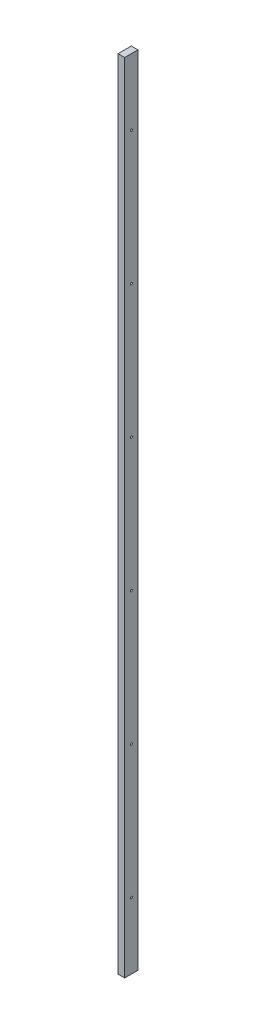
ISO-10303-21;
HEADER;
FILE_DESCRIPTION(('STEP AP214'),'2;1');
FILE_NAME('part.step','',(''),(''),'','','');
FILE_SCHEMA(('AUTOMOTIVE_DESIGN { 1 0 10303 214 1 1 1 1 }'));
ENDSEC;
DATA;
#1=APPLICATION_CONTEXT('core data for automotive mechanical design processes');
#2=APPLICATION_PROTOCOL_DEFINITION('international standard','automotive_design',2000,#1);
#3=PRODUCT_CONTEXT('',#1,'mechanical');
#4=PRODUCT('Part','Part','',(#3));
#5=PRODUCT_RELATED_PRODUCT_CATEGORY('part','',(#4));
#6=PRODUCT_DEFINITION_FORMATION('','',#4);
#7=PRODUCT_DEFINITION_CONTEXT('part definition',#1,'design');
#8=PRODUCT_DEFINITION('design','',#6,#7);
#9=PRODUCT_DEFINITION_SHAPE('','',#8);
#10=(LENGTH_UNIT() NAMED_UNIT(*) SI_UNIT(.MILLI.,.METRE.));
#11=(NAMED_UNIT(*) PLANE_ANGLE_UNIT() SI_UNIT($,.RADIAN.));
#12=(NAMED_UNIT(*) SI_UNIT($,.STERADIAN.) SOLID_ANGLE_UNIT());
#13=UNCERTAINTY_MEASURE_WITH_UNIT(LENGTH_MEASURE(1.E-05),#10,'distance_accuracy_value','');
#14=(GEOMETRIC_REPRESENTATION_CONTEXT(3) GLOBAL_UNCERTAINTY_ASSIGNED_CONTEXT((#13)) GLOBAL_UNIT_ASSIGNED_CONTEXT((#10,
#11,#12)) REPRESENTATION_CONTEXT('',''));
#15=CARTESIAN_POINT('',(0.,0.,0.));
#16=DIRECTION('',(0.,0.,1.));
#17=DIRECTION('',(1.,0.,0.));
#18=AXIS2_PLACEMENT_3D('',#15,#16,#17);
#19=CARTESIAN_POINT('',(-12.5,3000.,-25.));
#20=DIRECTION('',(1.,0.,0.));
#21=DIRECTION('',(0.,0.,-1.));
#22=AXIS2_PLACEMENT_3D('',#19,#20,#21);
#23=PLANE('',#22);
#24=CARTESIAN_POINT('',(-12.5,250.,0.));
#25=DIRECTION('',(1.,0.,0.));
#26=DIRECTION('',(0.,0.,-1.));
#27=AXIS2_PLACEMENT_3D('',#24,#25,#26);
#28=CIRCLE('',#27,4.);
#29=CARTESIAN_POINT('',(-12.5,250.,-4.));
#30=VERTEX_POINT('',#29);
#31=EDGE_CURVE('E114',#30,#30,#28,.T.);
#32=ORIENTED_EDGE('',*,*,#31,.T.);
#33=EDGE_LOOP('',(#32));
#34=FACE_BOUND('',#33,.T.);
#35=CARTESIAN_POINT('',(-12.5,2250.,0.));
#36=DIRECTION('',(1.,0.,0.));
#37=DIRECTION('',(0.,0.,-1.));
#38=AXIS2_PLACEMENT_3D('',#35,#36,#37);
#39=CIRCLE('',#38,4.);
#40=CARTESIAN_POINT('',(-12.5,2250.,-4.0000000000001));
#41=VERTEX_POINT('',#40);
#42=EDGE_CURVE('E134',#41,#41,#39,.T.);
#43=ORIENTED_EDGE('',*,*,#42,.T.);
#44=EDGE_LOOP('',(#43));
#45=FACE_BOUND('',#44,.T.);
#46=CARTESIAN_POINT('',(-12.5,2750.,0.));
#47=DIRECTION('',(1.,0.,0.));
#48=DIRECTION('',(0.,0.,-1.));
#49=AXIS2_PLACEMENT_3D('',#46,#47,#48);
#50=CIRCLE('',#49,4.);
#51=CARTESIAN_POINT('',(-12.5,2750.,-4.00000000000004));
#52=VERTEX_POINT('',#51);
#53=EDGE_CURVE('E138',#52,#52,#50,.T.);
#54=ORIENTED_EDGE('',*,*,#53,.T.);
#55=EDGE_LOOP('',(#54));
#56=FACE_BOUND('',#55,.T.);
#57=CARTESIAN_POINT('',(-12.5,1750.,0.));
#58=DIRECTION('',(1.,0.,0.));
#59=DIRECTION('',(0.,0.,-1.));
#60=AXIS2_PLACEMENT_3D('',#57,#58,#59);
#61=CIRCLE('',#60,4.);
#62=CARTESIAN_POINT('',(-12.5,1750.,-4.));
#63=VERTEX_POINT('',#62);
#64=EDGE_CURVE('E142',#63,#63,#61,.T.);
#65=ORIENTED_EDGE('',*,*,#64,.T.);
#66=EDGE_LOOP('',(#65));
#67=FACE_BOUND('',#66,.T.);
#68=CARTESIAN_POINT('',(-12.5,1250.,0.));
#69=DIRECTION('',(1.,0.,0.));
#70=DIRECTION('',(0.,0.,-1.));
#71=AXIS2_PLACEMENT_3D('',#68,#69,#70);
#72=CIRCLE('',#71,4.);
#73=CARTESIAN_POINT('',(-12.5,1250.,-4.));
#74=VERTEX_POINT('',#73);
#75=EDGE_CURVE('E146',#74,#74,#72,.T.);
#76=ORIENTED_EDGE('',*,*,#75,.T.);
#77=EDGE_LOOP('',(#76));
#78=FACE_BOUND('',#77,.T.);
#79=CARTESIAN_POINT('',(-12.5,750.,0.));
#80=DIRECTION('',(1.,0.,0.));
#81=DIRECTION('',(0.,0.,-1.));
#82=AXIS2_PLACEMENT_3D('',#79,#80,#81);
#83=CIRCLE('',#82,4.);
#84=CARTESIAN_POINT('',(-12.5,750.,-4.));
#85=VERTEX_POINT('',#84);
#86=EDGE_CURVE('E150',#85,#85,#83,.T.);
#87=ORIENTED_EDGE('',*,*,#86,.T.);
#88=EDGE_LOOP('',(#87));
#89=FACE_BOUND('',#88,.T.);
#90=DIRECTION('',(0.,0.,1.));
#91=VECTOR('',#90,1.);
#92=CARTESIAN_POINT('',(-12.5,0.,-25.));
#93=LINE('',#92,#91);
#94=CARTESIAN_POINT('',(-12.5,0.,-25.));
#95=VERTEX_POINT('',#94);
#96=CARTESIAN_POINT('',(-12.5,0.,25.));
#97=VERTEX_POINT('',#96);
#98=EDGE_CURVE('E110',#95,#97,#93,.T.);
#99=ORIENTED_EDGE('',*,*,#98,.T.);
#100=DIRECTION('',(0.,-1.,0.));
#101=VECTOR('',#100,1.);
#102=CARTESIAN_POINT('',(-12.5,3000.,25.));
#103=LINE('',#102,#101);
#104=CARTESIAN_POINT('',(-12.5,3000.,25.));
#105=VERTEX_POINT('',#104);
#106=EDGE_CURVE('E11',#105,#97,#103,.T.);
#107=ORIENTED_EDGE('',*,*,#106,.F.);
#108=DIRECTION('',(0.,0.,1.));
#109=VECTOR('',#108,1.);
#110=CARTESIAN_POINT('',(-12.5,3000.,-25.));
#111=LINE('',#110,#109);
#112=CARTESIAN_POINT('',(-12.5,3000.,-25.));
#113=VERTEX_POINT('',#112);
#114=EDGE_CURVE('E94',#113,#105,#111,.T.);
#115=ORIENTED_EDGE('',*,*,#114,.F.);
#116=DIRECTION('',(0.,-1.,0.));
#117=VECTOR('',#116,1.);
#118=CARTESIAN_POINT('',(-12.5,3000.,-25.));
#119=LINE('',#118,#117);
#120=EDGE_CURVE('E106',#113,#95,#119,.T.);
#121=ORIENTED_EDGE('',*,*,#120,.T.);
#122=EDGE_LOOP('',(#99,#107,#115,#121));
#123=FACE_BOUND('',#122,.T.);
#124=ADVANCED_FACE('F42',(#34,#45,#56,#67,#78,#89,#123),#23,.F.);
#125=CARTESIAN_POINT('',(12.5,3000.,25.));
#126=DIRECTION('',(0.,0.,-1.));
#127=DIRECTION('',(-1.,0.,0.));
#128=AXIS2_PLACEMENT_3D('',#125,#126,#127);
#129=PLANE('',#128);
#130=DIRECTION('',(1.,0.,0.));
#131=VECTOR('',#130,1.);
#132=CARTESIAN_POINT('',(12.5,0.,25.));
#133=LINE('',#132,#131);
#134=CARTESIAN_POINT('',(12.5,0.,25.));
#135=VERTEX_POINT('',#134);
#136=EDGE_CURVE('E99',#97,#135,#133,.T.);
#137=ORIENTED_EDGE('',*,*,#136,.T.);
#138=DIRECTION('',(0.,-1.,0.));
#139=VECTOR('',#138,1.);
#140=CARTESIAN_POINT('',(12.5,3000.,25.));
#141=LINE('',#140,#139);
#142=CARTESIAN_POINT('',(12.5,3000.,25.));
#143=VERTEX_POINT('',#142);
#144=EDGE_CURVE('E51',#143,#135,#141,.T.);
#145=ORIENTED_EDGE('',*,*,#144,.F.);
#146=DIRECTION('',(1.,0.,0.));
#147=VECTOR('',#146,1.);
#148=CARTESIAN_POINT('',(12.5,3000.,25.));
#149=LINE('',#148,#147);
#150=EDGE_CURVE('E89',#105,#143,#149,.T.);
#151=ORIENTED_EDGE('',*,*,#150,.F.);
#152=ORIENTED_EDGE('',*,*,#106,.T.);
#153=EDGE_LOOP('',(#137,#145,#151,#152));
#154=FACE_BOUND('',#153,.T.);
#155=ADVANCED_FACE('F98',(#154),#129,.F.);
#156=CARTESIAN_POINT('',(12.5,3000.,-25.));
#157=DIRECTION('',(-1.,0.,0.));
#158=DIRECTION('',(0.,0.,1.));
#159=AXIS2_PLACEMENT_3D('',#156,#157,#158);
#160=PLANE('',#159);
#161=CARTESIAN_POINT('',(12.5,250.,0.));
#162=DIRECTION('',(1.,0.,0.));
#163=DIRECTION('',(0.,0.,-1.));
#164=AXIS2_PLACEMENT_3D('',#161,#162,#163);
#165=CIRCLE('',#164,4.);
#166=CARTESIAN_POINT('',(12.5,250.,-4.));
#167=VERTEX_POINT('',#166);
#168=EDGE_CURVE('E154',#167,#167,#165,.T.);
#169=ORIENTED_EDGE('',*,*,#168,.F.);
#170=EDGE_LOOP('',(#169));
#171=FACE_BOUND('',#170,.T.);
#172=CARTESIAN_POINT('',(12.5,2250.,0.));
#173=DIRECTION('',(1.,0.,0.));
#174=DIRECTION('',(0.,0.,-1.));
#175=AXIS2_PLACEMENT_3D('',#172,#173,#174);
#176=CIRCLE('',#175,4.);
#177=CARTESIAN_POINT('',(12.5,2250.,-4.0000000000001));
#178=VERTEX_POINT('',#177);
#179=EDGE_CURVE('E160',#178,#178,#176,.T.);
#180=ORIENTED_EDGE('',*,*,#179,.F.);
#181=EDGE_LOOP('',(#180));
#182=FACE_BOUND('',#181,.T.);
#183=CARTESIAN_POINT('',(12.5,2750.,0.));
#184=DIRECTION('',(1.,0.,0.));
#185=DIRECTION('',(0.,0.,-1.));
#186=AXIS2_PLACEMENT_3D('',#183,#184,#185);
#187=CIRCLE('',#186,4.);
#188=CARTESIAN_POINT('',(12.5,2750.,-4.00000000000004));
#189=VERTEX_POINT('',#188);
#190=EDGE_CURVE('E155',#189,#189,#187,.T.);
#191=ORIENTED_EDGE('',*,*,#190,.F.);
#192=EDGE_LOOP('',(#191));
#193=FACE_BOUND('',#192,.T.);
#194=CARTESIAN_POINT('',(12.5,1750.,0.));
#195=DIRECTION('',(1.,0.,0.));
#196=DIRECTION('',(0.,0.,-1.));
#197=AXIS2_PLACEMENT_3D('',#194,#195,#196);
#198=CIRCLE('',#197,4.);
#199=CARTESIAN_POINT('',(12.5,1750.,-4.));
#200=VERTEX_POINT('',#199);
#201=EDGE_CURVE('E159',#200,#200,#198,.T.);
#202=ORIENTED_EDGE('',*,*,#201,.F.);
#203=EDGE_LOOP('',(#202));
#204=FACE_BOUND('',#203,.T.);
#205=CARTESIAN_POINT('',(12.5,1250.,0.));
#206=DIRECTION('',(1.,0.,0.));
#207=DIRECTION('',(0.,0.,-1.));
#208=AXIS2_PLACEMENT_3D('',#205,#206,#207);
#209=CIRCLE('',#208,4.);
#210=CARTESIAN_POINT('',(12.5,1250.,-4.));
#211=VERTEX_POINT('',#210);
#212=EDGE_CURVE('E164',#211,#211,#209,.T.);
#213=ORIENTED_EDGE('',*,*,#212,.F.);
#214=EDGE_LOOP('',(#213));
#215=FACE_BOUND('',#214,.T.);
#216=CARTESIAN_POINT('',(12.5,750.,0.));
#217=DIRECTION('',(1.,0.,0.));
#218=DIRECTION('',(0.,0.,-1.));
#219=AXIS2_PLACEMENT_3D('',#216,#217,#218);
#220=CIRCLE('',#219,4.);
#221=CARTESIAN_POINT('',(12.5,750.,-4.));
#222=VERTEX_POINT('',#221);
#223=EDGE_CURVE('E168',#222,#222,#220,.T.);
#224=ORIENTED_EDGE('',*,*,#223,.F.);
#225=EDGE_LOOP('',(#224));
#226=FACE_BOUND('',#225,.T.);
#227=DIRECTION('',(0.,0.,-1.));
#228=VECTOR('',#227,1.);
#229=CARTESIAN_POINT('',(12.5,0.,-25.));
#230=LINE('',#229,#228);
#231=CARTESIAN_POINT('',(12.5,0.,-25.));
#232=VERTEX_POINT('',#231);
#233=EDGE_CURVE('E76',#135,#232,#230,.T.);
#234=ORIENTED_EDGE('',*,*,#233,.T.);
#235=DIRECTION('',(0.,-1.,0.));
#236=VECTOR('',#235,1.);
#237=CARTESIAN_POINT('',(12.5,3000.,-25.));
#238=LINE('',#237,#236);
#239=CARTESIAN_POINT('',(12.5,3000.,-25.));
#240=VERTEX_POINT('',#239);
#241=EDGE_CURVE('E101',#240,#232,#238,.T.);
#242=ORIENTED_EDGE('',*,*,#241,.F.);
#243=DIRECTION('',(0.,0.,-1.));
#244=VECTOR('',#243,1.);
#245=CARTESIAN_POINT('',(12.5,3000.,-25.));
#246=LINE('',#245,#244);
#247=EDGE_CURVE('E92',#143,#240,#246,.T.);
#248=ORIENTED_EDGE('',*,*,#247,.F.);
#249=ORIENTED_EDGE('',*,*,#144,.T.);
#250=EDGE_LOOP('',(#234,#242,#248,#249));
#251=FACE_BOUND('',#250,.T.);
#252=ADVANCED_FACE('F102',(#171,#182,#193,#204,#215,#226,#251),#160,.F.);
#253=CARTESIAN_POINT('',(12.5,3000.,-25.));
#254=DIRECTION('',(0.,0.,1.));
#255=DIRECTION('',(1.,0.,0.));
#256=AXIS2_PLACEMENT_3D('',#253,#254,#255);
#257=PLANE('',#256);
#258=DIRECTION('',(-1.,0.,0.));
#259=VECTOR('',#258,1.);
#260=CARTESIAN_POINT('',(12.5,0.,-25.));
#261=LINE('',#260,#259);
#262=EDGE_CURVE('E82',#232,#95,#261,.T.);
#263=ORIENTED_EDGE('',*,*,#262,.T.);
#264=ORIENTED_EDGE('',*,*,#120,.F.);
#265=DIRECTION('',(-1.,0.,0.));
#266=VECTOR('',#265,1.);
#267=CARTESIAN_POINT('',(12.5,3000.,-25.));
#268=LINE('',#267,#266);
#269=EDGE_CURVE('E59',#240,#113,#268,.T.);
#270=ORIENTED_EDGE('',*,*,#269,.F.);
#271=ORIENTED_EDGE('',*,*,#241,.T.);
#272=EDGE_LOOP('',(#263,#264,#270,#271));
#273=FACE_BOUND('',#272,.T.);
#274=ADVANCED_FACE('F124',(#273),#257,.F.);
#275=CARTESIAN_POINT('',(0.,3000.,0.));
#276=DIRECTION('',(0.,-1.,0.));
#277=DIRECTION('',(0.,0.,-1.));
#278=AXIS2_PLACEMENT_3D('',#275,#276,#277);
#279=PLANE('',#278);
#280=ORIENTED_EDGE('',*,*,#114,.T.);
#281=ORIENTED_EDGE('',*,*,#150,.T.);
#282=ORIENTED_EDGE('',*,*,#247,.T.);
#283=ORIENTED_EDGE('',*,*,#269,.T.);
#284=EDGE_LOOP('',(#280,#281,#282,#283));
#285=FACE_BOUND('',#284,.T.);
#286=ADVANCED_FACE('F90',(#285),#279,.F.);
#287=CARTESIAN_POINT('',(0.,0.,0.));
#288=DIRECTION('',(0.,-1.,0.));
#289=DIRECTION('',(0.,0.,-1.));
#290=AXIS2_PLACEMENT_3D('',#287,#288,#289);
#291=PLANE('',#290);
#292=ORIENTED_EDGE('',*,*,#98,.F.);
#293=ORIENTED_EDGE('',*,*,#262,.F.);
#294=ORIENTED_EDGE('',*,*,#233,.F.);
#295=ORIENTED_EDGE('',*,*,#136,.F.);
#296=EDGE_LOOP('',(#292,#293,#294,#295));
#297=FACE_BOUND('',#296,.T.);
#298=ADVANCED_FACE('F127',(#297),#291,.T.);
#299=CARTESIAN_POINT('',(-87.5,750.,0.));
#300=DIRECTION('',(1.,0.,0.));
#301=DIRECTION('',(0.,0.,-1.));
#302=AXIS2_PLACEMENT_3D('',#299,#300,#301);
#303=CYLINDRICAL_SURFACE('',#302,4.);
#304=CARTESIAN_POINT('',(12.5,750.,-4.));
#305=CARTESIAN_POINT('',(12.2395833333333,750.,-4.));
#306=CARTESIAN_POINT('',(11.9791666666667,750.,-4.));
#307=CARTESIAN_POINT('',(11.4583333333333,750.,-4.));
#308=CARTESIAN_POINT('',(11.1979166666667,750.,-4.));
#309=CARTESIAN_POINT('',(10.6770833333333,750.,-4.));
#310=CARTESIAN_POINT('',(10.4166666666667,750.,-4.));
#311=CARTESIAN_POINT('',(9.89583333333333,750.,-4.));
#312=CARTESIAN_POINT('',(9.63541666666666,750.,-4.));
#313=CARTESIAN_POINT('',(9.11458333333333,750.,-4.));
#314=CARTESIAN_POINT('',(8.85416666666666,750.,-4.));
#315=CARTESIAN_POINT('',(8.33333333333333,750.,-4.));
#316=CARTESIAN_POINT('',(8.07291666666667,750.,-4.));
#317=CARTESIAN_POINT('',(7.55208333333333,750.,-4.));
#318=CARTESIAN_POINT('',(7.29166666666667,750.,-4.));
#319=CARTESIAN_POINT('',(6.77083333333333,750.,-4.));
#320=CARTESIAN_POINT('',(6.51041666666666,750.,-4.));
#321=CARTESIAN_POINT('',(5.98958333333333,750.,-4.));
#322=CARTESIAN_POINT('',(5.72916666666666,750.,-4.));
#323=CARTESIAN_POINT('',(5.20833333333333,750.,-4.));
#324=CARTESIAN_POINT('',(4.94791666666666,750.,-4.));
#325=CARTESIAN_POINT('',(4.42708333333333,750.,-4.));
#326=CARTESIAN_POINT('',(4.16666666666667,750.,-4.));
#327=CARTESIAN_POINT('',(3.64583333333333,750.,-4.));
#328=CARTESIAN_POINT('',(3.38541666666667,750.,-4.));
#329=CARTESIAN_POINT('',(2.86458333333333,750.,-4.));
#330=CARTESIAN_POINT('',(2.60416666666666,750.,-4.));
#331=CARTESIAN_POINT('',(2.08333333333333,750.,-4.));
#332=CARTESIAN_POINT('',(1.82291666666666,750.,-4.));
#333=CARTESIAN_POINT('',(1.30208333333333,750.,-4.));
#334=CARTESIAN_POINT('',(1.04166666666666,750.,-4.));
#335=CARTESIAN_POINT('',(0.520833333333331,750.,-4.));
#336=CARTESIAN_POINT('',(0.260416666666666,750.,-4.));
#337=CARTESIAN_POINT('',(-0.260416666666666,750.,-4.));
#338=CARTESIAN_POINT('',(-0.520833333333331,750.,-4.));
#339=CARTESIAN_POINT('',(-1.04166666666666,750.,-4.));
#340=CARTESIAN_POINT('',(-1.30208333333333,750.,-4.));
#341=CARTESIAN_POINT('',(-1.82291666666666,750.,-4.));
#342=CARTESIAN_POINT('',(-2.08333333333333,750.,-4.));
#343=CARTESIAN_POINT('',(-2.60416666666666,750.,-4.));
#344=CARTESIAN_POINT('',(-2.86458333333333,750.,-4.));
#345=CARTESIAN_POINT('',(-3.38541666666667,750.,-4.));
#346=CARTESIAN_POINT('',(-3.64583333333333,750.,-4.));
#347=CARTESIAN_POINT('',(-4.16666666666667,750.,-4.));
#348=CARTESIAN_POINT('',(-4.42708333333333,750.,-4.));
#349=CARTESIAN_POINT('',(-4.94791666666666,750.,-4.));
#350=CARTESIAN_POINT('',(-5.20833333333333,750.,-4.));
#351=CARTESIAN_POINT('',(-5.72916666666666,750.,-4.));
#352=CARTESIAN_POINT('',(-5.98958333333333,750.,-4.));
#353=CARTESIAN_POINT('',(-6.51041666666666,750.,-4.));
#354=CARTESIAN_POINT('',(-6.77083333333333,750.,-4.));
#355=CARTESIAN_POINT('',(-7.29166666666667,750.,-4.));
#356=CARTESIAN_POINT('',(-7.55208333333333,750.,-4.));
#357=CARTESIAN_POINT('',(-8.07291666666667,750.,-4.));
#358=CARTESIAN_POINT('',(-8.33333333333333,750.,-4.));
#359=CARTESIAN_POINT('',(-8.85416666666666,750.,-4.));
#360=CARTESIAN_POINT('',(-9.11458333333333,750.,-4.));
#361=CARTESIAN_POINT('',(-9.63541666666666,750.,-4.));
#362=CARTESIAN_POINT('',(-9.89583333333333,750.,-4.));
#363=CARTESIAN_POINT('',(-10.4166666666667,750.,-4.));
#364=CARTESIAN_POINT('',(-10.6770833333333,750.,-4.));
#365=CARTESIAN_POINT('',(-11.1979166666667,750.,-4.));
#366=CARTESIAN_POINT('',(-11.4583333333333,750.,-4.));
#367=CARTESIAN_POINT('',(-11.9791666666667,750.,-4.));
#368=CARTESIAN_POINT('',(-12.2395833333333,750.,-4.));
#369=CARTESIAN_POINT('',(-12.5,750.,-4.));
#370=B_SPLINE_CURVE_WITH_KNOTS('',3,(#304,#305,#306,#307,#308,#309,#310,#311,#312,#313,#314,
#315,#316,#317,#318,#319,#320,#321,#322,#323,#324,#325,#326,#327,#328,#329,#330,#331,#332,#333,
#334,#335,#336,#337,#338,#339,#340,#341,#342,#343,#344,#345,#346,#347,#348,#349,#350,#351,#352,
#353,#354,#355,#356,#357,#358,#359,#360,#361,#362,#363,#364,#365,#366,#367,#368,#369),
.UNSPECIFIED.,.F.,.F.,(4,2,2,2,2,2,2,2,2,2,2,2,2,2,2,2,2,2,2,2,2,2,2,2,2,2,2,2,2,2,2,2,4),(0.,
0.781249999999997,1.56249999999999,2.34375000000001,3.125,3.90625,4.6875,5.46874999999999,
6.25000000000001,7.03125,7.8125,8.59375,9.37499999999999,10.15625,10.9375,11.71875,12.5,
13.28125,14.0625,14.84375,15.625,16.40625,17.1875,17.96875,18.75,19.53125,20.3125,21.09375,
21.875,22.65625,23.4375,24.21875,25.),.UNSPECIFIED.);
#371=EDGE_CURVE('BSEAM195',#222,#85,#370,.T.);
#372=ORIENTED_EDGE('',*,*,#223,.T.);
#373=ORIENTED_EDGE('',*,*,#86,.F.);
#374=ORIENTED_EDGE('',*,*,#371,.T.);
#375=ORIENTED_EDGE('',*,*,#371,.F.);
#376=EDGE_LOOP('',(#372,#374,#373,#375));
#377=FACE_BOUND('',#376,.T.);
#378=ADVANCED_FACE('F195',(#377),#303,.F.);
#379=CARTESIAN_POINT('',(-87.5,1250.,0.));
#380=DIRECTION('',(1.,0.,0.));
#381=DIRECTION('',(0.,0.,-1.));
#382=AXIS2_PLACEMENT_3D('',#379,#380,#381);
#383=CYLINDRICAL_SURFACE('',#382,4.);
#384=CARTESIAN_POINT('',(12.5,1250.,-4.));
#385=CARTESIAN_POINT('',(12.2395833333333,1250.,-4.));
#386=CARTESIAN_POINT('',(11.9791666666667,1250.,-4.));
#387=CARTESIAN_POINT('',(11.4583333333333,1250.,-4.));
#388=CARTESIAN_POINT('',(11.1979166666667,1250.,-4.));
#389=CARTESIAN_POINT('',(10.6770833333333,1250.,-4.));
#390=CARTESIAN_POINT('',(10.4166666666667,1250.,-4.));
#391=CARTESIAN_POINT('',(9.89583333333333,1250.,-4.));
#392=CARTESIAN_POINT('',(9.63541666666666,1250.,-4.));
#393=CARTESIAN_POINT('',(9.11458333333333,1250.,-4.));
#394=CARTESIAN_POINT('',(8.85416666666666,1250.,-4.));
#395=CARTESIAN_POINT('',(8.33333333333333,1250.,-4.));
#396=CARTESIAN_POINT('',(8.07291666666667,1250.,-4.));
#397=CARTESIAN_POINT('',(7.55208333333333,1250.,-4.));
#398=CARTESIAN_POINT('',(7.29166666666667,1250.,-4.));
#399=CARTESIAN_POINT('',(6.77083333333333,1250.,-4.));
#400=CARTESIAN_POINT('',(6.51041666666666,1250.,-4.));
#401=CARTESIAN_POINT('',(5.98958333333333,1250.,-4.));
#402=CARTESIAN_POINT('',(5.72916666666666,1250.,-4.));
#403=CARTESIAN_POINT('',(5.20833333333333,1250.,-4.));
#404=CARTESIAN_POINT('',(4.94791666666666,1250.,-4.));
#405=CARTESIAN_POINT('',(4.42708333333333,1250.,-4.));
#406=CARTESIAN_POINT('',(4.16666666666667,1250.,-4.));
#407=CARTESIAN_POINT('',(3.64583333333333,1250.,-4.));
#408=CARTESIAN_POINT('',(3.38541666666667,1250.,-4.));
#409=CARTESIAN_POINT('',(2.86458333333333,1250.,-4.));
#410=CARTESIAN_POINT('',(2.60416666666666,1250.,-4.));
#411=CARTESIAN_POINT('',(2.08333333333333,1250.,-4.));
#412=CARTESIAN_POINT('',(1.82291666666666,1250.,-4.));
#413=CARTESIAN_POINT('',(1.30208333333333,1250.,-4.));
#414=CARTESIAN_POINT('',(1.04166666666666,1250.,-4.));
#415=CARTESIAN_POINT('',(0.520833333333331,1250.,-4.));
#416=CARTESIAN_POINT('',(0.260416666666666,1250.,-4.));
#417=CARTESIAN_POINT('',(-0.260416666666666,1250.,-4.));
#418=CARTESIAN_POINT('',(-0.520833333333331,1250.,-4.));
#419=CARTESIAN_POINT('',(-1.04166666666666,1250.,-4.));
#420=CARTESIAN_POINT('',(-1.30208333333333,1250.,-4.));
#421=CARTESIAN_POINT('',(-1.82291666666666,1250.,-4.));
#422=CARTESIAN_POINT('',(-2.08333333333333,1250.,-4.));
#423=CARTESIAN_POINT('',(-2.60416666666666,1250.,-4.));
#424=CARTESIAN_POINT('',(-2.86458333333333,1250.,-4.));
#425=CARTESIAN_POINT('',(-3.38541666666667,1250.,-4.));
#426=CARTESIAN_POINT('',(-3.64583333333333,1250.,-4.));
#427=CARTESIAN_POINT('',(-4.16666666666667,1250.,-4.));
#428=CARTESIAN_POINT('',(-4.42708333333333,1250.,-4.));
#429=CARTESIAN_POINT('',(-4.94791666666666,1250.,-4.));
#430=CARTESIAN_POINT('',(-5.20833333333333,1250.,-4.));
#431=CARTESIAN_POINT('',(-5.72916666666666,1250.,-4.));
#432=CARTESIAN_POINT('',(-5.98958333333333,1250.,-4.));
#433=CARTESIAN_POINT('',(-6.51041666666666,1250.,-4.));
#434=CARTESIAN_POINT('',(-6.77083333333333,1250.,-4.));
#435=CARTESIAN_POINT('',(-7.29166666666667,1250.,-4.));
#436=CARTESIAN_POINT('',(-7.55208333333333,1250.,-4.));
#437=CARTESIAN_POINT('',(-8.07291666666667,1250.,-4.));
#438=CARTESIAN_POINT('',(-8.33333333333333,1250.,-4.));
#439=CARTESIAN_POINT('',(-8.85416666666666,1250.,-4.));
#440=CARTESIAN_POINT('',(-9.11458333333333,1250.,-4.));
#441=CARTESIAN_POINT('',(-9.63541666666666,1250.,-4.));
#442=CARTESIAN_POINT('',(-9.89583333333333,1250.,-4.));
#443=CARTESIAN_POINT('',(-10.4166666666667,1250.,-4.));
#444=CARTESIAN_POINT('',(-10.6770833333333,1250.,-4.));
#445=CARTESIAN_POINT('',(-11.1979166666667,1250.,-4.));
#446=CARTESIAN_POINT('',(-11.4583333333333,1250.,-4.));
#447=CARTESIAN_POINT('',(-11.9791666666667,1250.,-4.));
#448=CARTESIAN_POINT('',(-12.2395833333333,1250.,-4.));
#449=CARTESIAN_POINT('',(-12.5,1250.,-4.));
#450=B_SPLINE_CURVE_WITH_KNOTS('',3,(#384,#385,#386,#387,#388,#389,#390,#391,#392,#393,#394,
#395,#396,#397,#398,#399,#400,#401,#402,#403,#404,#405,#406,#407,#408,#409,#410,#411,#412,#413,
#414,#415,#416,#417,#418,#419,#420,#421,#422,#423,#424,#425,#426,#427,#428,#429,#430,#431,#432,
#433,#434,#435,#436,#437,#438,#439,#440,#441,#442,#443,#444,#445,#446,#447,#448,#449),
.UNSPECIFIED.,.F.,.F.,(4,2,2,2,2,2,2,2,2,2,2,2,2,2,2,2,2,2,2,2,2,2,2,2,2,2,2,2,2,2,2,2,4),(0.,
0.781249999999997,1.56249999999999,2.34375000000001,3.125,3.90625,4.6875,5.46874999999999,
6.25000000000001,7.03125,7.8125,8.59375,9.37499999999999,10.15625,10.9375,11.71875,12.5,
13.28125,14.0625,14.84375,15.625,16.40625,17.1875,17.96875,18.75,19.53125,20.3125,21.09375,
21.875,22.65625,23.4375,24.21875,25.),.UNSPECIFIED.);
#451=EDGE_CURVE('BSEAM198',#211,#74,#450,.T.);
#452=ORIENTED_EDGE('',*,*,#212,.T.);
#453=ORIENTED_EDGE('',*,*,#75,.F.);
#454=ORIENTED_EDGE('',*,*,#451,.T.);
#455=ORIENTED_EDGE('',*,*,#451,.F.);
#456=EDGE_LOOP('',(#452,#454,#453,#455));
#457=FACE_BOUND('',#456,.T.);
#458=ADVANCED_FACE('F198',(#457),#383,.F.);
#459=CARTESIAN_POINT('',(-87.5,1750.,0.));
#460=DIRECTION('',(1.,0.,0.));
#461=DIRECTION('',(0.,0.,-1.));
#462=AXIS2_PLACEMENT_3D('',#459,#460,#461);
#463=CYLINDRICAL_SURFACE('',#462,4.);
#464=CARTESIAN_POINT('',(12.5,1750.,-4.));
#465=CARTESIAN_POINT('',(12.2395833333333,1750.,-4.));
#466=CARTESIAN_POINT('',(11.9791666666667,1750.,-4.));
#467=CARTESIAN_POINT('',(11.4583333333333,1750.,-4.));
#468=CARTESIAN_POINT('',(11.1979166666667,1750.,-4.));
#469=CARTESIAN_POINT('',(10.6770833333333,1750.,-4.));
#470=CARTESIAN_POINT('',(10.4166666666667,1750.,-4.));
#471=CARTESIAN_POINT('',(9.89583333333333,1750.,-4.));
#472=CARTESIAN_POINT('',(9.63541666666666,1750.,-4.));
#473=CARTESIAN_POINT('',(9.11458333333333,1750.,-4.));
#474=CARTESIAN_POINT('',(8.85416666666666,1750.,-4.));
#475=CARTESIAN_POINT('',(8.33333333333333,1750.,-4.));
#476=CARTESIAN_POINT('',(8.07291666666667,1750.,-4.));
#477=CARTESIAN_POINT('',(7.55208333333333,1750.,-4.));
#478=CARTESIAN_POINT('',(7.29166666666667,1750.,-4.));
#479=CARTESIAN_POINT('',(6.77083333333333,1750.,-4.));
#480=CARTESIAN_POINT('',(6.51041666666666,1750.,-4.));
#481=CARTESIAN_POINT('',(5.98958333333333,1750.,-4.));
#482=CARTESIAN_POINT('',(5.72916666666666,1750.,-4.));
#483=CARTESIAN_POINT('',(5.20833333333333,1750.,-4.));
#484=CARTESIAN_POINT('',(4.94791666666666,1750.,-4.));
#485=CARTESIAN_POINT('',(4.42708333333333,1750.,-4.));
#486=CARTESIAN_POINT('',(4.16666666666667,1750.,-4.));
#487=CARTESIAN_POINT('',(3.64583333333333,1750.,-4.));
#488=CARTESIAN_POINT('',(3.38541666666667,1750.,-4.));
#489=CARTESIAN_POINT('',(2.86458333333333,1750.,-4.));
#490=CARTESIAN_POINT('',(2.60416666666666,1750.,-4.));
#491=CARTESIAN_POINT('',(2.08333333333333,1750.,-4.));
#492=CARTESIAN_POINT('',(1.82291666666666,1750.,-4.));
#493=CARTESIAN_POINT('',(1.30208333333333,1750.,-4.));
#494=CARTESIAN_POINT('',(1.04166666666666,1750.,-4.));
#495=CARTESIAN_POINT('',(0.520833333333331,1750.,-4.));
#496=CARTESIAN_POINT('',(0.260416666666666,1750.,-4.));
#497=CARTESIAN_POINT('',(-0.260416666666666,1750.,-4.));
#498=CARTESIAN_POINT('',(-0.520833333333331,1750.,-4.));
#499=CARTESIAN_POINT('',(-1.04166666666666,1750.,-4.));
#500=CARTESIAN_POINT('',(-1.30208333333333,1750.,-4.));
#501=CARTESIAN_POINT('',(-1.82291666666666,1750.,-4.));
#502=CARTESIAN_POINT('',(-2.08333333333333,1750.,-4.));
#503=CARTESIAN_POINT('',(-2.60416666666666,1750.,-4.));
#504=CARTESIAN_POINT('',(-2.86458333333333,1750.,-4.));
#505=CARTESIAN_POINT('',(-3.38541666666667,1750.,-4.));
#506=CARTESIAN_POINT('',(-3.64583333333333,1750.,-4.));
#507=CARTESIAN_POINT('',(-4.16666666666667,1750.,-4.));
#508=CARTESIAN_POINT('',(-4.42708333333333,1750.,-4.));
#509=CARTESIAN_POINT('',(-4.94791666666666,1750.,-4.));
#510=CARTESIAN_POINT('',(-5.20833333333333,1750.,-4.));
#511=CARTESIAN_POINT('',(-5.72916666666666,1750.,-4.));
#512=CARTESIAN_POINT('',(-5.98958333333333,1750.,-4.));
#513=CARTESIAN_POINT('',(-6.51041666666666,1750.,-4.));
#514=CARTESIAN_POINT('',(-6.77083333333333,1750.,-4.));
#515=CARTESIAN_POINT('',(-7.29166666666667,1750.,-4.));
#516=CARTESIAN_POINT('',(-7.55208333333333,1750.,-4.));
#517=CARTESIAN_POINT('',(-8.07291666666667,1750.,-4.));
#518=CARTESIAN_POINT('',(-8.33333333333333,1750.,-4.));
#519=CARTESIAN_POINT('',(-8.85416666666666,1750.,-4.));
#520=CARTESIAN_POINT('',(-9.11458333333333,1750.,-4.));
#521=CARTESIAN_POINT('',(-9.63541666666666,1750.,-4.));
#522=CARTESIAN_POINT('',(-9.89583333333333,1750.,-4.));
#523=CARTESIAN_POINT('',(-10.4166666666667,1750.,-4.));
#524=CARTESIAN_POINT('',(-10.6770833333333,1750.,-4.));
#525=CARTESIAN_POINT('',(-11.1979166666667,1750.,-4.));
#526=CARTESIAN_POINT('',(-11.4583333333333,1750.,-4.));
#527=CARTESIAN_POINT('',(-11.9791666666667,1750.,-4.));
#528=CARTESIAN_POINT('',(-12.2395833333333,1750.,-4.));
#529=CARTESIAN_POINT('',(-12.5,1750.,-4.));
#530=B_SPLINE_CURVE_WITH_KNOTS('',3,(#464,#465,#466,#467,#468,#469,#470,#471,#472,#473,#474,
#475,#476,#477,#478,#479,#480,#481,#482,#483,#484,#485,#486,#487,#488,#489,#490,#491,#492,#493,
#494,#495,#496,#497,#498,#499,#500,#501,#502,#503,#504,#505,#506,#507,#508,#509,#510,#511,#512,
#513,#514,#515,#516,#517,#518,#519,#520,#521,#522,#523,#524,#525,#526,#527,#528,#529),
.UNSPECIFIED.,.F.,.F.,(4,2,2,2,2,2,2,2,2,2,2,2,2,2,2,2,2,2,2,2,2,2,2,2,2,2,2,2,2,2,2,2,4),(0.,
0.781249999999997,1.56249999999999,2.34375000000001,3.125,3.90625,4.6875,5.46874999999999,
6.25000000000001,7.03125,7.8125,8.59375,9.37499999999999,10.15625,10.9375,11.71875,12.5,
13.28125,14.0625,14.84375,15.625,16.40625,17.1875,17.96875,18.75,19.53125,20.3125,21.09375,
21.875,22.65625,23.4375,24.21875,25.),.UNSPECIFIED.);
#531=EDGE_CURVE('BSEAM219',#200,#63,#530,.T.);
#532=ORIENTED_EDGE('',*,*,#201,.T.);
#533=ORIENTED_EDGE('',*,*,#64,.F.);
#534=ORIENTED_EDGE('',*,*,#531,.T.);
#535=ORIENTED_EDGE('',*,*,#531,.F.);
#536=EDGE_LOOP('',(#532,#534,#533,#535));
#537=FACE_BOUND('',#536,.T.);
#538=ADVANCED_FACE('F219',(#537),#463,.F.);
#539=CARTESIAN_POINT('',(-87.5,2750.,0.));
#540=DIRECTION('',(1.,0.,0.));
#541=DIRECTION('',(0.,0.,-1.));
#542=AXIS2_PLACEMENT_3D('',#539,#540,#541);
#543=CYLINDRICAL_SURFACE('',#542,4.);
#544=CARTESIAN_POINT('',(12.5,2750.,-4.00000000000004));
#545=CARTESIAN_POINT('',(12.2395833333333,2750.,-4.00000000000004));
#546=CARTESIAN_POINT('',(11.9791666666667,2750.,-4.00000000000004));
#547=CARTESIAN_POINT('',(11.4583333333333,2750.,-4.00000000000004));
#548=CARTESIAN_POINT('',(11.1979166666667,2750.,-4.00000000000004));
#549=CARTESIAN_POINT('',(10.6770833333333,2750.,-4.00000000000004));
#550=CARTESIAN_POINT('',(10.4166666666667,2750.,-4.00000000000004));
#551=CARTESIAN_POINT('',(9.89583333333333,2750.,-4.00000000000004));
#552=CARTESIAN_POINT('',(9.63541666666666,2750.,-4.00000000000004));
#553=CARTESIAN_POINT('',(9.11458333333333,2750.,-4.00000000000004));
#554=CARTESIAN_POINT('',(8.85416666666666,2750.,-4.00000000000004));
#555=CARTESIAN_POINT('',(8.33333333333333,2750.,-4.00000000000004));
#556=CARTESIAN_POINT('',(8.07291666666667,2750.,-4.00000000000004));
#557=CARTESIAN_POINT('',(7.55208333333333,2750.,-4.00000000000004));
#558=CARTESIAN_POINT('',(7.29166666666667,2750.,-4.00000000000004));
#559=CARTESIAN_POINT('',(6.77083333333333,2750.,-4.00000000000004));
#560=CARTESIAN_POINT('',(6.51041666666666,2750.,-4.00000000000004));
#561=CARTESIAN_POINT('',(5.98958333333333,2750.,-4.00000000000004));
#562=CARTESIAN_POINT('',(5.72916666666666,2750.,-4.00000000000004));
#563=CARTESIAN_POINT('',(5.20833333333333,2750.,-4.00000000000004));
#564=CARTESIAN_POINT('',(4.94791666666666,2750.,-4.00000000000004));
#565=CARTESIAN_POINT('',(4.42708333333333,2750.,-4.00000000000004));
#566=CARTESIAN_POINT('',(4.16666666666667,2750.,-4.00000000000004));
#567=CARTESIAN_POINT('',(3.64583333333333,2750.,-4.00000000000004));
#568=CARTESIAN_POINT('',(3.38541666666667,2750.,-4.00000000000004));
#569=CARTESIAN_POINT('',(2.86458333333333,2750.,-4.00000000000004));
#570=CARTESIAN_POINT('',(2.60416666666666,2750.,-4.00000000000004));
#571=CARTESIAN_POINT('',(2.08333333333333,2750.,-4.00000000000004));
#572=CARTESIAN_POINT('',(1.82291666666666,2750.,-4.00000000000004));
#573=CARTESIAN_POINT('',(1.30208333333333,2750.,-4.00000000000004));
#574=CARTESIAN_POINT('',(1.04166666666666,2750.,-4.00000000000004));
#575=CARTESIAN_POINT('',(0.520833333333331,2750.,-4.00000000000004));
#576=CARTESIAN_POINT('',(0.260416666666666,2750.,-4.00000000000004));
#577=CARTESIAN_POINT('',(-0.260416666666666,2750.,-4.00000000000004));
#578=CARTESIAN_POINT('',(-0.520833333333331,2750.,-4.00000000000004));
#579=CARTESIAN_POINT('',(-1.04166666666666,2750.,-4.00000000000004));
#580=CARTESIAN_POINT('',(-1.30208333333333,2750.,-4.00000000000004));
#581=CARTESIAN_POINT('',(-1.82291666666666,2750.,-4.00000000000004));
#582=CARTESIAN_POINT('',(-2.08333333333333,2750.,-4.00000000000004));
#583=CARTESIAN_POINT('',(-2.60416666666666,2750.,-4.00000000000004));
#584=CARTESIAN_POINT('',(-2.86458333333333,2750.,-4.00000000000004));
#585=CARTESIAN_POINT('',(-3.38541666666667,2750.,-4.00000000000004));
#586=CARTESIAN_POINT('',(-3.64583333333333,2750.,-4.00000000000004));
#587=CARTESIAN_POINT('',(-4.16666666666667,2750.,-4.00000000000004));
#588=CARTESIAN_POINT('',(-4.42708333333333,2750.,-4.00000000000004));
#589=CARTESIAN_POINT('',(-4.94791666666666,2750.,-4.00000000000004));
#590=CARTESIAN_POINT('',(-5.20833333333333,2750.,-4.00000000000004));
#591=CARTESIAN_POINT('',(-5.72916666666666,2750.,-4.00000000000004));
#592=CARTESIAN_POINT('',(-5.98958333333333,2750.,-4.00000000000004));
#593=CARTESIAN_POINT('',(-6.51041666666666,2750.,-4.00000000000004));
#594=CARTESIAN_POINT('',(-6.77083333333333,2750.,-4.00000000000004));
#595=CARTESIAN_POINT('',(-7.29166666666667,2750.,-4.00000000000004));
#596=CARTESIAN_POINT('',(-7.55208333333333,2750.,-4.00000000000004));
#597=CARTESIAN_POINT('',(-8.07291666666667,2750.,-4.00000000000004));
#598=CARTESIAN_POINT('',(-8.33333333333333,2750.,-4.00000000000004));
#599=CARTESIAN_POINT('',(-8.85416666666666,2750.,-4.00000000000004));
#600=CARTESIAN_POINT('',(-9.11458333333333,2750.,-4.00000000000004));
#601=CARTESIAN_POINT('',(-9.63541666666666,2750.,-4.00000000000004));
#602=CARTESIAN_POINT('',(-9.89583333333333,2750.,-4.00000000000004));
#603=CARTESIAN_POINT('',(-10.4166666666667,2750.,-4.00000000000004));
#604=CARTESIAN_POINT('',(-10.6770833333333,2750.,-4.00000000000004));
#605=CARTESIAN_POINT('',(-11.1979166666667,2750.,-4.00000000000004));
#606=CARTESIAN_POINT('',(-11.4583333333333,2750.,-4.00000000000004));
#607=CARTESIAN_POINT('',(-11.9791666666667,2750.,-4.00000000000004));
#608=CARTESIAN_POINT('',(-12.2395833333333,2750.,-4.00000000000004));
#609=CARTESIAN_POINT('',(-12.5,2750.,-4.00000000000004));
#610=B_SPLINE_CURVE_WITH_KNOTS('',3,(#544,#545,#546,#547,#548,#549,#550,#551,#552,#553,#554,
#555,#556,#557,#558,#559,#560,#561,#562,#563,#564,#565,#566,#567,#568,#569,#570,#571,#572,#573,
#574,#575,#576,#577,#578,#579,#580,#581,#582,#583,#584,#585,#586,#587,#588,#589,#590,#591,#592,
#593,#594,#595,#596,#597,#598,#599,#600,#601,#602,#603,#604,#605,#606,#607,#608,#609),
.UNSPECIFIED.,.F.,.F.,(4,2,2,2,2,2,2,2,2,2,2,2,2,2,2,2,2,2,2,2,2,2,2,2,2,2,2,2,2,2,2,2,4),(0.,
0.781249999999997,1.56249999999999,2.34375000000001,3.125,3.90625,4.6875,5.46874999999999,
6.25000000000001,7.03125,7.8125,8.59375,9.37499999999999,10.15625,10.9375,11.71875,12.5,
13.28125,14.0625,14.84375,15.625,16.40625,17.1875,17.96875,18.75,19.53125,20.3125,21.09375,
21.875,22.65625,23.4375,24.21875,25.),.UNSPECIFIED.);
#611=EDGE_CURVE('BSEAM225',#189,#52,#610,.T.);
#612=ORIENTED_EDGE('',*,*,#190,.T.);
#613=ORIENTED_EDGE('',*,*,#53,.F.);
#614=ORIENTED_EDGE('',*,*,#611,.T.);
#615=ORIENTED_EDGE('',*,*,#611,.F.);
#616=EDGE_LOOP('',(#612,#614,#613,#615));
#617=FACE_BOUND('',#616,.T.);
#618=ADVANCED_FACE('F225',(#617),#543,.F.);
#619=CARTESIAN_POINT('',(-87.5,2250.,0.));
#620=DIRECTION('',(1.,0.,0.));
#621=DIRECTION('',(0.,0.,-1.));
#622=AXIS2_PLACEMENT_3D('',#619,#620,#621);
#623=CYLINDRICAL_SURFACE('',#622,4.);
#624=CARTESIAN_POINT('',(12.5,2250.,-4.0000000000001));
#625=CARTESIAN_POINT('',(12.2395833333333,2250.,-4.0000000000001));
#626=CARTESIAN_POINT('',(11.9791666666667,2250.,-4.0000000000001));
#627=CARTESIAN_POINT('',(11.4583333333333,2250.,-4.0000000000001));
#628=CARTESIAN_POINT('',(11.1979166666667,2250.,-4.0000000000001));
#629=CARTESIAN_POINT('',(10.6770833333333,2250.,-4.0000000000001));
#630=CARTESIAN_POINT('',(10.4166666666667,2250.,-4.0000000000001));
#631=CARTESIAN_POINT('',(9.89583333333333,2250.,-4.0000000000001));
#632=CARTESIAN_POINT('',(9.63541666666666,2250.,-4.0000000000001));
#633=CARTESIAN_POINT('',(9.11458333333333,2250.,-4.0000000000001));
#634=CARTESIAN_POINT('',(8.85416666666666,2250.,-4.0000000000001));
#635=CARTESIAN_POINT('',(8.33333333333333,2250.,-4.0000000000001));
#636=CARTESIAN_POINT('',(8.07291666666667,2250.,-4.0000000000001));
#637=CARTESIAN_POINT('',(7.55208333333333,2250.,-4.0000000000001));
#638=CARTESIAN_POINT('',(7.29166666666667,2250.,-4.0000000000001));
#639=CARTESIAN_POINT('',(6.77083333333333,2250.,-4.0000000000001));
#640=CARTESIAN_POINT('',(6.51041666666666,2250.,-4.0000000000001));
#641=CARTESIAN_POINT('',(5.98958333333333,2250.,-4.0000000000001));
#642=CARTESIAN_POINT('',(5.72916666666666,2250.,-4.0000000000001));
#643=CARTESIAN_POINT('',(5.20833333333333,2250.,-4.0000000000001));
#644=CARTESIAN_POINT('',(4.94791666666666,2250.,-4.0000000000001));
#645=CARTESIAN_POINT('',(4.42708333333333,2250.,-4.0000000000001));
#646=CARTESIAN_POINT('',(4.16666666666667,2250.,-4.0000000000001));
#647=CARTESIAN_POINT('',(3.64583333333333,2250.,-4.0000000000001));
#648=CARTESIAN_POINT('',(3.38541666666667,2250.,-4.0000000000001));
#649=CARTESIAN_POINT('',(2.86458333333333,2250.,-4.0000000000001));
#650=CARTESIAN_POINT('',(2.60416666666666,2250.,-4.0000000000001));
#651=CARTESIAN_POINT('',(2.08333333333333,2250.,-4.0000000000001));
#652=CARTESIAN_POINT('',(1.82291666666666,2250.,-4.0000000000001));
#653=CARTESIAN_POINT('',(1.30208333333333,2250.,-4.0000000000001));
#654=CARTESIAN_POINT('',(1.04166666666666,2250.,-4.0000000000001));
#655=CARTESIAN_POINT('',(0.520833333333331,2250.,-4.0000000000001));
#656=CARTESIAN_POINT('',(0.260416666666666,2250.,-4.0000000000001));
#657=CARTESIAN_POINT('',(-0.260416666666666,2250.,-4.0000000000001));
#658=CARTESIAN_POINT('',(-0.520833333333331,2250.,-4.0000000000001));
#659=CARTESIAN_POINT('',(-1.04166666666666,2250.,-4.0000000000001));
#660=CARTESIAN_POINT('',(-1.30208333333333,2250.,-4.0000000000001));
#661=CARTESIAN_POINT('',(-1.82291666666666,2250.,-4.0000000000001));
#662=CARTESIAN_POINT('',(-2.08333333333333,2250.,-4.0000000000001));
#663=CARTESIAN_POINT('',(-2.60416666666666,2250.,-4.0000000000001));
#664=CARTESIAN_POINT('',(-2.86458333333333,2250.,-4.0000000000001));
#665=CARTESIAN_POINT('',(-3.38541666666667,2250.,-4.0000000000001));
#666=CARTESIAN_POINT('',(-3.64583333333333,2250.,-4.0000000000001));
#667=CARTESIAN_POINT('',(-4.16666666666667,2250.,-4.0000000000001));
#668=CARTESIAN_POINT('',(-4.42708333333333,2250.,-4.0000000000001));
#669=CARTESIAN_POINT('',(-4.94791666666666,2250.,-4.0000000000001));
#670=CARTESIAN_POINT('',(-5.20833333333333,2250.,-4.0000000000001));
#671=CARTESIAN_POINT('',(-5.72916666666666,2250.,-4.0000000000001));
#672=CARTESIAN_POINT('',(-5.98958333333333,2250.,-4.0000000000001));
#673=CARTESIAN_POINT('',(-6.51041666666666,2250.,-4.0000000000001));
#674=CARTESIAN_POINT('',(-6.77083333333333,2250.,-4.0000000000001));
#675=CARTESIAN_POINT('',(-7.29166666666667,2250.,-4.0000000000001));
#676=CARTESIAN_POINT('',(-7.55208333333333,2250.,-4.0000000000001));
#677=CARTESIAN_POINT('',(-8.07291666666667,2250.,-4.0000000000001));
#678=CARTESIAN_POINT('',(-8.33333333333333,2250.,-4.0000000000001));
#679=CARTESIAN_POINT('',(-8.85416666666666,2250.,-4.0000000000001));
#680=CARTESIAN_POINT('',(-9.11458333333333,2250.,-4.0000000000001));
#681=CARTESIAN_POINT('',(-9.63541666666666,2250.,-4.0000000000001));
#682=CARTESIAN_POINT('',(-9.89583333333333,2250.,-4.0000000000001));
#683=CARTESIAN_POINT('',(-10.4166666666667,2250.,-4.0000000000001));
#684=CARTESIAN_POINT('',(-10.6770833333333,2250.,-4.0000000000001));
#685=CARTESIAN_POINT('',(-11.1979166666667,2250.,-4.0000000000001));
#686=CARTESIAN_POINT('',(-11.4583333333333,2250.,-4.0000000000001));
#687=CARTESIAN_POINT('',(-11.9791666666667,2250.,-4.0000000000001));
#688=CARTESIAN_POINT('',(-12.2395833333333,2250.,-4.0000000000001));
#689=CARTESIAN_POINT('',(-12.5,2250.,-4.0000000000001));
#690=B_SPLINE_CURVE_WITH_KNOTS('',3,(#624,#625,#626,#627,#628,#629,#630,#631,#632,#633,#634,
#635,#636,#637,#638,#639,#640,#641,#642,#643,#644,#645,#646,#647,#648,#649,#650,#651,#652,#653,
#654,#655,#656,#657,#658,#659,#660,#661,#662,#663,#664,#665,#666,#667,#668,#669,#670,#671,#672,
#673,#674,#675,#676,#677,#678,#679,#680,#681,#682,#683,#684,#685,#686,#687,#688,#689),
.UNSPECIFIED.,.F.,.F.,(4,2,2,2,2,2,2,2,2,2,2,2,2,2,2,2,2,2,2,2,2,2,2,2,2,2,2,2,2,2,2,2,4),(0.,
0.781249999999997,1.56249999999999,2.34375000000001,3.125,3.90625,4.6875,5.46874999999999,
6.25000000000001,7.03125,7.8125,8.59375,9.37499999999999,10.15625,10.9375,11.71875,12.5,
13.28125,14.0625,14.84375,15.625,16.40625,17.1875,17.96875,18.75,19.53125,20.3125,21.09375,
21.875,22.65625,23.4375,24.21875,25.),.UNSPECIFIED.);
#691=EDGE_CURVE('BSEAM232',#178,#41,#690,.T.);
#692=ORIENTED_EDGE('',*,*,#179,.T.);
#693=ORIENTED_EDGE('',*,*,#42,.F.);
#694=ORIENTED_EDGE('',*,*,#691,.T.);
#695=ORIENTED_EDGE('',*,*,#691,.F.);
#696=EDGE_LOOP('',(#692,#694,#693,#695));
#697=FACE_BOUND('',#696,.T.);
#698=ADVANCED_FACE('F232',(#697),#623,.F.);
#699=CARTESIAN_POINT('',(-87.5,250.,0.));
#700=DIRECTION('',(1.,0.,0.));
#701=DIRECTION('',(0.,0.,-1.));
#702=AXIS2_PLACEMENT_3D('',#699,#700,#701);
#703=CYLINDRICAL_SURFACE('',#702,4.);
#704=CARTESIAN_POINT('',(12.5,250.,-4.));
#705=CARTESIAN_POINT('',(12.2395833333333,250.,-4.));
#706=CARTESIAN_POINT('',(11.9791666666667,250.,-4.));
#707=CARTESIAN_POINT('',(11.4583333333333,250.,-4.));
#708=CARTESIAN_POINT('',(11.1979166666667,250.,-4.));
#709=CARTESIAN_POINT('',(10.6770833333333,250.,-4.));
#710=CARTESIAN_POINT('',(10.4166666666667,250.,-4.));
#711=CARTESIAN_POINT('',(9.89583333333333,250.,-4.));
#712=CARTESIAN_POINT('',(9.63541666666666,250.,-4.));
#713=CARTESIAN_POINT('',(9.11458333333333,250.,-4.));
#714=CARTESIAN_POINT('',(8.85416666666666,250.,-4.));
#715=CARTESIAN_POINT('',(8.33333333333333,250.,-4.));
#716=CARTESIAN_POINT('',(8.07291666666667,250.,-4.));
#717=CARTESIAN_POINT('',(7.55208333333333,250.,-4.));
#718=CARTESIAN_POINT('',(7.29166666666667,250.,-4.));
#719=CARTESIAN_POINT('',(6.77083333333333,250.,-4.));
#720=CARTESIAN_POINT('',(6.51041666666666,250.,-4.));
#721=CARTESIAN_POINT('',(5.98958333333333,250.,-4.));
#722=CARTESIAN_POINT('',(5.72916666666666,250.,-4.));
#723=CARTESIAN_POINT('',(5.20833333333333,250.,-4.));
#724=CARTESIAN_POINT('',(4.94791666666666,250.,-4.));
#725=CARTESIAN_POINT('',(4.42708333333333,250.,-4.));
#726=CARTESIAN_POINT('',(4.16666666666667,250.,-4.));
#727=CARTESIAN_POINT('',(3.64583333333333,250.,-4.));
#728=CARTESIAN_POINT('',(3.38541666666667,250.,-4.));
#729=CARTESIAN_POINT('',(2.86458333333333,250.,-4.));
#730=CARTESIAN_POINT('',(2.60416666666666,250.,-4.));
#731=CARTESIAN_POINT('',(2.08333333333333,250.,-4.));
#732=CARTESIAN_POINT('',(1.82291666666666,250.,-4.));
#733=CARTESIAN_POINT('',(1.30208333333333,250.,-4.));
#734=CARTESIAN_POINT('',(1.04166666666666,250.,-4.));
#735=CARTESIAN_POINT('',(0.520833333333331,250.,-4.));
#736=CARTESIAN_POINT('',(0.260416666666666,250.,-4.));
#737=CARTESIAN_POINT('',(-0.260416666666666,250.,-4.));
#738=CARTESIAN_POINT('',(-0.520833333333331,250.,-4.));
#739=CARTESIAN_POINT('',(-1.04166666666666,250.,-4.));
#740=CARTESIAN_POINT('',(-1.30208333333333,250.,-4.));
#741=CARTESIAN_POINT('',(-1.82291666666666,250.,-4.));
#742=CARTESIAN_POINT('',(-2.08333333333333,250.,-4.));
#743=CARTESIAN_POINT('',(-2.60416666666666,250.,-4.));
#744=CARTESIAN_POINT('',(-2.86458333333333,250.,-4.));
#745=CARTESIAN_POINT('',(-3.38541666666667,250.,-4.));
#746=CARTESIAN_POINT('',(-3.64583333333333,250.,-4.));
#747=CARTESIAN_POINT('',(-4.16666666666667,250.,-4.));
#748=CARTESIAN_POINT('',(-4.42708333333333,250.,-4.));
#749=CARTESIAN_POINT('',(-4.94791666666666,250.,-4.));
#750=CARTESIAN_POINT('',(-5.20833333333333,250.,-4.));
#751=CARTESIAN_POINT('',(-5.72916666666666,250.,-4.));
#752=CARTESIAN_POINT('',(-5.98958333333333,250.,-4.));
#753=CARTESIAN_POINT('',(-6.51041666666666,250.,-4.));
#754=CARTESIAN_POINT('',(-6.77083333333333,250.,-4.));
#755=CARTESIAN_POINT('',(-7.29166666666667,250.,-4.));
#756=CARTESIAN_POINT('',(-7.55208333333333,250.,-4.));
#757=CARTESIAN_POINT('',(-8.07291666666667,250.,-4.));
#758=CARTESIAN_POINT('',(-8.33333333333333,250.,-4.));
#759=CARTESIAN_POINT('',(-8.85416666666666,250.,-4.));
#760=CARTESIAN_POINT('',(-9.11458333333333,250.,-4.));
#761=CARTESIAN_POINT('',(-9.63541666666666,250.,-4.));
#762=CARTESIAN_POINT('',(-9.89583333333333,250.,-4.));
#763=CARTESIAN_POINT('',(-10.4166666666667,250.,-4.));
#764=CARTESIAN_POINT('',(-10.6770833333333,250.,-4.));
#765=CARTESIAN_POINT('',(-11.1979166666667,250.,-4.));
#766=CARTESIAN_POINT('',(-11.4583333333333,250.,-4.));
#767=CARTESIAN_POINT('',(-11.9791666666667,250.,-4.));
#768=CARTESIAN_POINT('',(-12.2395833333333,250.,-4.));
#769=CARTESIAN_POINT('',(-12.5,250.,-4.));
#770=B_SPLINE_CURVE_WITH_KNOTS('',3,(#704,#705,#706,#707,#708,#709,#710,#711,#712,#713,#714,
#715,#716,#717,#718,#719,#720,#721,#722,#723,#724,#725,#726,#727,#728,#729,#730,#731,#732,#733,
#734,#735,#736,#737,#738,#739,#740,#741,#742,#743,#744,#745,#746,#747,#748,#749,#750,#751,#752,
#753,#754,#755,#756,#757,#758,#759,#760,#761,#762,#763,#764,#765,#766,#767,#768,#769),
.UNSPECIFIED.,.F.,.F.,(4,2,2,2,2,2,2,2,2,2,2,2,2,2,2,2,2,2,2,2,2,2,2,2,2,2,2,2,2,2,2,2,4),(0.,
0.781249999999997,1.56249999999999,2.34375000000001,3.125,3.90625,4.6875,5.46874999999999,
6.25000000000001,7.03125,7.8125,8.59375,9.37499999999999,10.15625,10.9375,11.71875,12.5,
13.28125,14.0625,14.84375,15.625,16.40625,17.1875,17.96875,18.75,19.53125,20.3125,21.09375,
21.875,22.65625,23.4375,24.21875,25.),.UNSPECIFIED.);
#771=EDGE_CURVE('BSEAM179',#167,#30,#770,.T.);
#772=ORIENTED_EDGE('',*,*,#168,.T.);
#773=ORIENTED_EDGE('',*,*,#31,.F.);
#774=ORIENTED_EDGE('',*,*,#771,.T.);
#775=ORIENTED_EDGE('',*,*,#771,.F.);
#776=EDGE_LOOP('',(#772,#774,#773,#775));
#777=FACE_BOUND('',#776,.T.);
#778=ADVANCED_FACE('F179',(#777),#703,.F.);
#779=CLOSED_SHELL('',(#124,#155,#252,#274,#286,#298,#378,#458,#538,#618,#698,#778));
#780=MANIFOLD_SOLID_BREP('B2',#779);
#781=ADVANCED_BREP_SHAPE_REPRESENTATION('',(#18,#780),#14);
#782=SHAPE_DEFINITION_REPRESENTATION(#9,#781);
ENDSEC;
END-ISO-10303-21;
